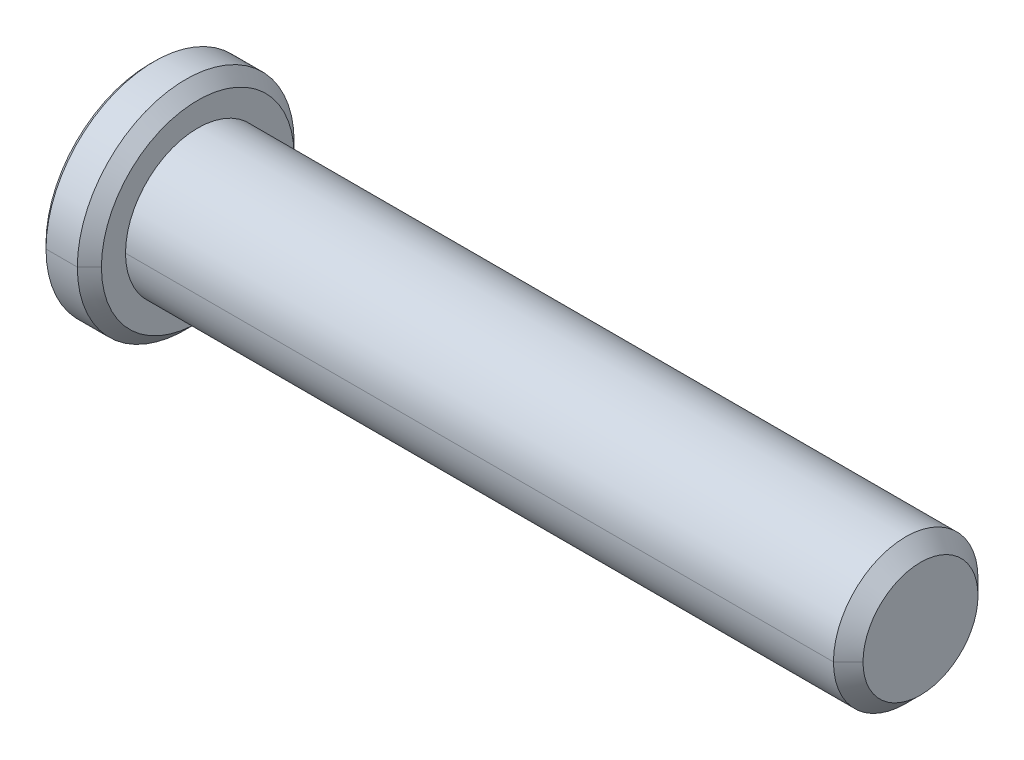
ISO-10303-21;
HEADER;
FILE_DESCRIPTION(('STEP AP214'),'2;1');
FILE_NAME('part.step','',(''),(''),'','','');
FILE_SCHEMA(('AUTOMOTIVE_DESIGN { 1 0 10303 214 1 1 1 1 }'));
ENDSEC;
DATA;
#1=APPLICATION_CONTEXT('core data for automotive mechanical design processes');
#2=APPLICATION_PROTOCOL_DEFINITION('international standard','automotive_design',2000,#1);
#3=PRODUCT_CONTEXT('',#1,'mechanical');
#4=PRODUCT('Part','Part','',(#3));
#5=PRODUCT_RELATED_PRODUCT_CATEGORY('part','',(#4));
#6=PRODUCT_DEFINITION_FORMATION('','',#4);
#7=PRODUCT_DEFINITION_CONTEXT('part definition',#1,'design');
#8=PRODUCT_DEFINITION('design','',#6,#7);
#9=PRODUCT_DEFINITION_SHAPE('','',#8);
#10=(LENGTH_UNIT() NAMED_UNIT(*) SI_UNIT(.MILLI.,.METRE.));
#11=(NAMED_UNIT(*) PLANE_ANGLE_UNIT() SI_UNIT($,.RADIAN.));
#12=(NAMED_UNIT(*) SI_UNIT($,.STERADIAN.) SOLID_ANGLE_UNIT());
#13=UNCERTAINTY_MEASURE_WITH_UNIT(LENGTH_MEASURE(1.E-05),#10,'distance_accuracy_value','');
#14=(GEOMETRIC_REPRESENTATION_CONTEXT(3) GLOBAL_UNCERTAINTY_ASSIGNED_CONTEXT((#13)) GLOBAL_UNIT_ASSIGNED_CONTEXT((#10,
#11,#12)) REPRESENTATION_CONTEXT('',''));
#15=CARTESIAN_POINT('',(0.,0.,0.));
#16=DIRECTION('',(0.,0.,1.));
#17=DIRECTION('',(1.,0.,0.));
#18=AXIS2_PLACEMENT_3D('',#15,#16,#17);
#19=CARTESIAN_POINT('',(-2.,0.,0.));
#20=DIRECTION('',(1.,0.,0.));
#21=DIRECTION('',(0.,-1.,0.));
#22=AXIS2_PLACEMENT_3D('',#19,#20,#21);
#23=CONICAL_SURFACE('',#22,4.3,0.7853981634);
#24=CARTESIAN_POINT('',(-1.8,0.,0.));
#25=DIRECTION('',(1.,0.,0.));
#26=DIRECTION('',(0.,0.,-1.));
#27=AXIS2_PLACEMENT_3D('',#24,#25,#26);
#28=CIRCLE('',#27,4.5);
#29=CARTESIAN_POINT('',(-1.8,0.,-4.5));
#30=VERTEX_POINT('',#29);
#31=CARTESIAN_POINT('',(-1.80000000000051,0.,4.50000000000051));
#32=VERTEX_POINT('',#31);
#33=EDGE_CURVE('E12',#30,#32,#28,.T.);
#34=ORIENTED_EDGE('',*,*,#33,.F.);
#35=CARTESIAN_POINT('',(-2.,0.,-4.3));
#36=DIRECTION('',(0.707106781184743,0.,-0.707106781188352));
#37=VECTOR('',#36,1.);
#38=LINE('',#35,#37);
#39=CARTESIAN_POINT('',(-2.,0.,-4.3));
#40=VERTEX_POINT('',#39);
#41=EDGE_CURVE('E30',#40,#30,#38,.T.);
#42=ORIENTED_EDGE('',*,*,#41,.F.);
#43=CARTESIAN_POINT('',(-2.,0.,0.));
#44=DIRECTION('',(1.,0.,0.));
#45=DIRECTION('',(0.,0.,-1.));
#46=AXIS2_PLACEMENT_3D('',#43,#44,#45);
#47=CIRCLE('',#46,4.3);
#48=CARTESIAN_POINT('',(-2.,0.,4.3));
#49=VERTEX_POINT('',#48);
#50=EDGE_CURVE('E201',#40,#49,#47,.T.);
#51=ORIENTED_EDGE('',*,*,#50,.T.);
#52=CARTESIAN_POINT('',(-2.,0.,4.3));
#53=DIRECTION('',(0.707106781184743,0.,0.707106781188352));
#54=VECTOR('',#53,1.);
#55=LINE('',#52,#54);
#56=EDGE_CURVE('E199',#49,#32,#55,.T.);
#57=ORIENTED_EDGE('',*,*,#56,.T.);
#58=EDGE_LOOP('',(#34,#42,#51,#57));
#59=FACE_BOUND('',#58,.T.);
#60=ADVANCED_FACE('F20',(#59),#23,.T.);
#61=CARTESIAN_POINT('',(-2.,0.,0.));
#62=DIRECTION('',(1.,0.,0.));
#63=DIRECTION('',(0.,1.,0.));
#64=AXIS2_PLACEMENT_3D('',#61,#62,#63);
#65=CONICAL_SURFACE('',#64,4.3,0.7853981634);
#66=CARTESIAN_POINT('',(-2.,0.,0.));
#67=DIRECTION('',(1.,0.,0.));
#68=DIRECTION('',(0.,0.,-1.));
#69=AXIS2_PLACEMENT_3D('',#66,#67,#68);
#70=CIRCLE('',#69,4.3);
#71=EDGE_CURVE('E185',#49,#40,#70,.T.);
#72=ORIENTED_EDGE('',*,*,#71,.T.);
#73=ORIENTED_EDGE('',*,*,#41,.T.);
#74=CARTESIAN_POINT('',(-1.8,0.,0.));
#75=DIRECTION('',(1.,0.,0.));
#76=DIRECTION('',(0.,0.,-1.));
#77=AXIS2_PLACEMENT_3D('',#74,#75,#76);
#78=CIRCLE('',#77,4.5);
#79=EDGE_CURVE('E356',#32,#30,#78,.T.);
#80=ORIENTED_EDGE('',*,*,#79,.F.);
#81=ORIENTED_EDGE('',*,*,#56,.F.);
#82=EDGE_LOOP('',(#72,#73,#80,#81));
#83=FACE_BOUND('',#82,.T.);
#84=ADVANCED_FACE('F330',(#83),#65,.T.);
#85=CARTESIAN_POINT('',(30.,0.,0.));
#86=DIRECTION('',(-1.,0.,0.));
#87=DIRECTION('',(0.,1.,0.));
#88=AXIS2_PLACEMENT_3D('',#85,#86,#87);
#89=CYLINDRICAL_SURFACE('',#88,4.5);
#90=ORIENTED_EDGE('',*,*,#79,.T.);
#91=CARTESIAN_POINT('',(-0.5,0.,-4.5));
#92=DIRECTION('',(-1.,0.,0.));
#93=VECTOR('',#92,1.);
#94=LINE('',#91,#93);
#95=CARTESIAN_POINT('',(-0.5,0.,-4.5));
#96=VERTEX_POINT('',#95);
#97=EDGE_CURVE('E359',#96,#30,#94,.T.);
#98=ORIENTED_EDGE('',*,*,#97,.F.);
#99=CARTESIAN_POINT('',(-0.5,0.,0.));
#100=DIRECTION('',(1.,0.,0.));
#101=DIRECTION('',(0.,0.,-1.));
#102=AXIS2_PLACEMENT_3D('',#99,#100,#101);
#103=CIRCLE('',#102,4.5);
#104=CARTESIAN_POINT('',(-0.5,0.,4.5));
#105=VERTEX_POINT('',#104);
#106=EDGE_CURVE('E365',#105,#96,#103,.T.);
#107=ORIENTED_EDGE('',*,*,#106,.F.);
#108=CARTESIAN_POINT('',(-0.5,0.,4.5));
#109=DIRECTION('',(-1.,0.,0.));
#110=VECTOR('',#109,1.);
#111=LINE('',#108,#110);
#112=EDGE_CURVE('E371',#105,#32,#111,.T.);
#113=ORIENTED_EDGE('',*,*,#112,.T.);
#114=EDGE_LOOP('',(#90,#98,#107,#113));
#115=FACE_BOUND('',#114,.T.);
#116=ADVANCED_FACE('F339',(#115),#89,.T.);
#117=CARTESIAN_POINT('',(30.,0.,0.));
#118=DIRECTION('',(-1.,0.,0.));
#119=DIRECTION('',(0.,-1.,0.));
#120=AXIS2_PLACEMENT_3D('',#117,#118,#119);
#121=CYLINDRICAL_SURFACE('',#120,4.5);
#122=CARTESIAN_POINT('',(-0.5,0.,0.));
#123=DIRECTION('',(1.,0.,0.));
#124=DIRECTION('',(0.,0.,-1.));
#125=AXIS2_PLACEMENT_3D('',#122,#123,#124);
#126=CIRCLE('',#125,4.5);
#127=EDGE_CURVE('E377',#96,#105,#126,.T.);
#128=ORIENTED_EDGE('',*,*,#127,.F.);
#129=ORIENTED_EDGE('',*,*,#97,.T.);
#130=ORIENTED_EDGE('',*,*,#33,.T.);
#131=ORIENTED_EDGE('',*,*,#112,.F.);
#132=EDGE_LOOP('',(#128,#129,#130,#131));
#133=FACE_BOUND('',#132,.T.);
#134=ADVANCED_FACE('F434',(#133),#121,.T.);
#135=CARTESIAN_POINT('',(-0.5,0.,0.));
#136=DIRECTION('',(-1.,0.,0.));
#137=DIRECTION('',(0.,-1.,0.));
#138=AXIS2_PLACEMENT_3D('',#135,#136,#137);
#139=CONICAL_SURFACE('',#138,4.5,0.7853981634);
#140=CARTESIAN_POINT('',(0.,0.,0.));
#141=DIRECTION('',(1.,0.,0.));
#142=DIRECTION('',(0.,0.,-1.));
#143=AXIS2_PLACEMENT_3D('',#140,#141,#142);
#144=CIRCLE('',#143,4.);
#145=CARTESIAN_POINT('',(0.,0.,-4.));
#146=VERTEX_POINT('',#145);
#147=CARTESIAN_POINT('',(-1.275812788748E-12,0.,3.99999999999872));
#148=VERTEX_POINT('',#147);
#149=EDGE_CURVE('E468',#146,#148,#144,.T.);
#150=ORIENTED_EDGE('',*,*,#149,.F.);
#151=CARTESIAN_POINT('',(-1.27578069636369E-12,0.,-3.99999999999872));
#152=DIRECTION('',(-0.707106781184743,0.,-0.707106781188352));
#153=VECTOR('',#152,1.);
#154=LINE('',#151,#153);
#155=EDGE_CURVE('E450',#146,#96,#154,.T.);
#156=ORIENTED_EDGE('',*,*,#155,.T.);
#157=ORIENTED_EDGE('',*,*,#127,.T.);
#158=CARTESIAN_POINT('',(-1.27578069636369E-12,0.,3.99999999999872));
#159=DIRECTION('',(-0.707106781184743,0.,0.707106781188352));
#160=VECTOR('',#159,1.);
#161=LINE('',#158,#160);
#162=EDGE_CURVE('E463',#148,#105,#161,.T.);
#163=ORIENTED_EDGE('',*,*,#162,.F.);
#164=EDGE_LOOP('',(#150,#156,#157,#163));
#165=FACE_BOUND('',#164,.T.);
#166=ADVANCED_FACE('F425',(#165),#139,.T.);
#167=CARTESIAN_POINT('',(-0.5,0.,0.));
#168=DIRECTION('',(-1.,0.,0.));
#169=DIRECTION('',(0.,1.,0.));
#170=AXIS2_PLACEMENT_3D('',#167,#168,#169);
#171=CONICAL_SURFACE('',#170,4.5,0.7853981634);
#172=ORIENTED_EDGE('',*,*,#106,.T.);
#173=ORIENTED_EDGE('',*,*,#155,.F.);
#174=CARTESIAN_POINT('',(0.,0.,0.));
#175=DIRECTION('',(1.,0.,0.));
#176=DIRECTION('',(0.,0.,-1.));
#177=AXIS2_PLACEMENT_3D('',#174,#175,#176);
#178=CIRCLE('',#177,4.);
#179=EDGE_CURVE('E402',#148,#146,#178,.T.);
#180=ORIENTED_EDGE('',*,*,#179,.F.);
#181=ORIENTED_EDGE('',*,*,#162,.T.);
#182=EDGE_LOOP('',(#172,#173,#180,#181));
#183=FACE_BOUND('',#182,.T.);
#184=ADVANCED_FACE('F433',(#183),#171,.T.);
#185=CARTESIAN_POINT('',(0.,4.,0.));
#186=DIRECTION('',(-1.,0.,0.));
#187=DIRECTION('',(0.,0.,1.));
#188=AXIS2_PLACEMENT_3D('',#185,#186,#187);
#189=PLANE('',#188);
#190=CARTESIAN_POINT('',(0.,0.,0.));
#191=DIRECTION('',(1.,0.,0.));
#192=DIRECTION('',(0.,0.,-1.));
#193=AXIS2_PLACEMENT_3D('',#190,#191,#192);
#194=CIRCLE('',#193,3.);
#195=CARTESIAN_POINT('',(0.,0.,-3.));
#196=VERTEX_POINT('',#195);
#197=CARTESIAN_POINT('',(0.,0.,3.));
#198=VERTEX_POINT('',#197);
#199=EDGE_CURVE('E397',#196,#198,#194,.T.);
#200=ORIENTED_EDGE('',*,*,#199,.F.);
#201=CARTESIAN_POINT('',(0.,0.,0.));
#202=DIRECTION('',(1.,0.,0.));
#203=DIRECTION('',(0.,0.,-1.));
#204=AXIS2_PLACEMENT_3D('',#201,#202,#203);
#205=CIRCLE('',#204,3.);
#206=EDGE_CURVE('E395',#198,#196,#205,.T.);
#207=ORIENTED_EDGE('',*,*,#206,.F.);
#208=EDGE_LOOP('',(#200,#207));
#209=FACE_BOUND('',#208,.T.);
#210=ORIENTED_EDGE('',*,*,#149,.T.);
#211=ORIENTED_EDGE('',*,*,#179,.T.);
#212=EDGE_LOOP('',(#210,#211));
#213=FACE_BOUND('',#212,.T.);
#214=ADVANCED_FACE('F599',(#209,#213),#189,.F.);
#215=CARTESIAN_POINT('',(30.,0.,0.));
#216=DIRECTION('',(-1.,0.,0.));
#217=DIRECTION('',(0.,1.,0.));
#218=AXIS2_PLACEMENT_3D('',#215,#216,#217);
#219=CYLINDRICAL_SURFACE('',#218,3.);
#220=ORIENTED_EDGE('',*,*,#206,.T.);
#221=CARTESIAN_POINT('',(29.3865,0.,-3.));
#222=DIRECTION('',(-1.,0.,0.));
#223=VECTOR('',#222,1.);
#224=LINE('',#221,#223);
#225=CARTESIAN_POINT('',(29.3865,0.,-3.));
#226=VERTEX_POINT('',#225);
#227=EDGE_CURVE('E554',#226,#196,#224,.T.);
#228=ORIENTED_EDGE('',*,*,#227,.F.);
#229=CARTESIAN_POINT('',(29.3865,0.,0.));
#230=DIRECTION('',(1.,0.,0.));
#231=DIRECTION('',(0.,0.,-1.));
#232=AXIS2_PLACEMENT_3D('',#229,#230,#231);
#233=CIRCLE('',#232,3.);
#234=CARTESIAN_POINT('',(29.3865,0.,3.));
#235=VERTEX_POINT('',#234);
#236=EDGE_CURVE('E550',#235,#226,#233,.T.);
#237=ORIENTED_EDGE('',*,*,#236,.F.);
#238=CARTESIAN_POINT('',(29.3865,0.,3.));
#239=DIRECTION('',(-1.,0.,0.));
#240=VECTOR('',#239,1.);
#241=LINE('',#238,#240);
#242=EDGE_CURVE('E547',#235,#198,#241,.T.);
#243=ORIENTED_EDGE('',*,*,#242,.T.);
#244=EDGE_LOOP('',(#220,#228,#237,#243));
#245=FACE_BOUND('',#244,.T.);
#246=ADVANCED_FACE('F527',(#245),#219,.T.);
#247=CARTESIAN_POINT('',(30.,0.,0.));
#248=DIRECTION('',(-1.,0.,0.));
#249=DIRECTION('',(0.,-1.,0.));
#250=AXIS2_PLACEMENT_3D('',#247,#248,#249);
#251=CYLINDRICAL_SURFACE('',#250,3.);
#252=CARTESIAN_POINT('',(29.3865,0.,0.));
#253=DIRECTION('',(1.,0.,0.));
#254=DIRECTION('',(0.,0.,-1.));
#255=AXIS2_PLACEMENT_3D('',#252,#253,#254);
#256=CIRCLE('',#255,3.);
#257=EDGE_CURVE('E543',#226,#235,#256,.T.);
#258=ORIENTED_EDGE('',*,*,#257,.F.);
#259=ORIENTED_EDGE('',*,*,#227,.T.);
#260=ORIENTED_EDGE('',*,*,#199,.T.);
#261=ORIENTED_EDGE('',*,*,#242,.F.);
#262=EDGE_LOOP('',(#258,#259,#260,#261));
#263=FACE_BOUND('',#262,.T.);
#264=ADVANCED_FACE('F518',(#263),#251,.T.);
#265=CARTESIAN_POINT('',(29.3865,0.,0.));
#266=DIRECTION('',(-1.,0.,0.));
#267=DIRECTION('',(0.,-1.,0.));
#268=AXIS2_PLACEMENT_3D('',#265,#266,#267);
#269=CONICAL_SURFACE('',#268,3.,0.7853981634);
#270=CARTESIAN_POINT('',(30.,0.,0.));
#271=DIRECTION('',(1.,0.,0.));
#272=DIRECTION('',(0.,0.,-1.));
#273=AXIS2_PLACEMENT_3D('',#270,#271,#272);
#274=CIRCLE('',#273,2.3865);
#275=CARTESIAN_POINT('',(30.,0.,-2.3865));
#276=VERTEX_POINT('',#275);
#277=CARTESIAN_POINT('',(29.9999999999984,0.,2.38649999999844));
#278=VERTEX_POINT('',#277);
#279=EDGE_CURVE('E539',#276,#278,#274,.T.);
#280=ORIENTED_EDGE('',*,*,#279,.F.);
#281=CARTESIAN_POINT('',(29.9999999999984,0.,-2.38649999999843));
#282=DIRECTION('',(-0.707106781184743,0.,-0.707106781188351));
#283=VECTOR('',#282,1.);
#284=LINE('',#281,#283);
#285=EDGE_CURVE('E294',#276,#226,#284,.T.);
#286=ORIENTED_EDGE('',*,*,#285,.T.);
#287=ORIENTED_EDGE('',*,*,#257,.T.);
#288=CARTESIAN_POINT('',(29.9999999999984,0.,2.38649999999843));
#289=DIRECTION('',(-0.707106781184743,0.,0.707106781188351));
#290=VECTOR('',#289,1.);
#291=LINE('',#288,#290);
#292=EDGE_CURVE('E307',#278,#235,#291,.T.);
#293=ORIENTED_EDGE('',*,*,#292,.F.);
#294=EDGE_LOOP('',(#280,#286,#287,#293));
#295=FACE_BOUND('',#294,.T.);
#296=ADVANCED_FACE('F272',(#295),#269,.T.);
#297=CARTESIAN_POINT('',(29.3865,0.,0.));
#298=DIRECTION('',(-1.,0.,0.));
#299=DIRECTION('',(0.,1.,0.));
#300=AXIS2_PLACEMENT_3D('',#297,#298,#299);
#301=CONICAL_SURFACE('',#300,3.,0.7853981634);
#302=ORIENTED_EDGE('',*,*,#236,.T.);
#303=ORIENTED_EDGE('',*,*,#285,.F.);
#304=CARTESIAN_POINT('',(30.,0.,0.));
#305=DIRECTION('',(1.,0.,0.));
#306=DIRECTION('',(0.,0.,-1.));
#307=AXIS2_PLACEMENT_3D('',#304,#305,#306);
#308=CIRCLE('',#307,2.3865);
#309=EDGE_CURVE('E250',#278,#276,#308,.T.);
#310=ORIENTED_EDGE('',*,*,#309,.F.);
#311=ORIENTED_EDGE('',*,*,#292,.T.);
#312=EDGE_LOOP('',(#302,#303,#310,#311));
#313=FACE_BOUND('',#312,.T.);
#314=ADVANCED_FACE('F261',(#313),#301,.T.);
#315=CARTESIAN_POINT('',(30.,2.3865,0.));
#316=DIRECTION('',(-1.,0.,0.));
#317=DIRECTION('',(0.,0.,1.));
#318=AXIS2_PLACEMENT_3D('',#315,#316,#317);
#319=PLANE('',#318);
#320=ORIENTED_EDGE('',*,*,#279,.T.);
#321=ORIENTED_EDGE('',*,*,#309,.T.);
#322=EDGE_LOOP('',(#320,#321));
#323=FACE_BOUND('',#322,.T.);
#324=ADVANCED_FACE('F271',(#323),#319,.F.);
#325=CARTESIAN_POINT('',(-2.,0.,0.));
#326=DIRECTION('',(1.,0.,0.));
#327=DIRECTION('',(0.,0.,-1.));
#328=AXIS2_PLACEMENT_3D('',#325,#326,#327);
#329=PLANE('',#328);
#330=ORIENTED_EDGE('',*,*,#50,.F.);
#331=ORIENTED_EDGE('',*,*,#71,.F.);
#332=EDGE_LOOP('',(#330,#331));
#333=FACE_BOUND('',#332,.T.);
#334=DIRECTION('',(0.,0.500000000000009,0.866025403784433));
#335=VECTOR('',#334,1.);
#336=CARTESIAN_POINT('',(-2.,-1.7320508075689,0.));
#337=LINE('',#336,#335);
#338=CARTESIAN_POINT('',(-2.,-1.7320508075689,0.));
#339=VERTEX_POINT('',#338);
#340=CARTESIAN_POINT('',(-2.,-0.86602540378444,1.5));
#341=VERTEX_POINT('',#340);
#342=EDGE_CURVE('E244',#339,#341,#337,.T.);
#343=ORIENTED_EDGE('',*,*,#342,.F.);
#344=DIRECTION('',(0.,-0.500000000000009,0.866025403784433));
#345=VECTOR('',#344,1.);
#346=CARTESIAN_POINT('',(-2.,-0.86602540378444,-1.5));
#347=LINE('',#346,#345);
#348=CARTESIAN_POINT('',(-2.,-0.86602540378444,-1.5));
#349=VERTEX_POINT('',#348);
#350=EDGE_CURVE('E240',#349,#339,#347,.T.);
#351=ORIENTED_EDGE('',*,*,#350,.F.);
#352=DIRECTION('',(0.,-1.,0.));
#353=VECTOR('',#352,1.);
#354=CARTESIAN_POINT('',(-2.,0.86602540378444,-1.5));
#355=LINE('',#354,#353);
#356=CARTESIAN_POINT('',(-2.,0.86602540378444,-1.5));
#357=VERTEX_POINT('',#356);
#358=EDGE_CURVE('E231',#357,#349,#355,.T.);
#359=ORIENTED_EDGE('',*,*,#358,.F.);
#360=DIRECTION('',(0.,-0.500000000000009,-0.866025403784433));
#361=VECTOR('',#360,1.);
#362=CARTESIAN_POINT('',(-2.,1.7320508075689,0.));
#363=LINE('',#362,#361);
#364=CARTESIAN_POINT('',(-2.,1.7320508075689,0.));
#365=VERTEX_POINT('',#364);
#366=EDGE_CURVE('E225',#365,#357,#363,.T.);
#367=ORIENTED_EDGE('',*,*,#366,.F.);
#368=DIRECTION('',(0.,0.500000000000009,-0.866025403784433));
#369=VECTOR('',#368,1.);
#370=CARTESIAN_POINT('',(-2.,0.86602540378444,1.5));
#371=LINE('',#370,#369);
#372=CARTESIAN_POINT('',(-2.,0.86602540378444,1.5));
#373=VERTEX_POINT('',#372);
#374=EDGE_CURVE('E133',#373,#365,#371,.T.);
#375=ORIENTED_EDGE('',*,*,#374,.F.);
#376=DIRECTION('',(0.,1.,0.));
#377=VECTOR('',#376,1.);
#378=CARTESIAN_POINT('',(-2.,-0.86602540378444,1.5));
#379=LINE('',#378,#377);
#380=EDGE_CURVE('E221',#341,#373,#379,.T.);
#381=ORIENTED_EDGE('',*,*,#380,.F.);
#382=EDGE_LOOP('',(#343,#351,#359,#367,#375,#381));
#383=FACE_BOUND('',#382,.T.);
#384=ADVANCED_FACE('F629',(#333,#383),#329,.F.);
#385=CARTESIAN_POINT('',(-0.5,-0.86602540378444,1.5));
#386=DIRECTION('',(0.,0.,1.));
#387=DIRECTION('',(1.,0.,0.));
#388=AXIS2_PLACEMENT_3D('',#385,#386,#387);
#389=PLANE('',#388);
#390=ORIENTED_EDGE('',*,*,#380,.T.);
#391=DIRECTION('',(-1.,0.,0.));
#392=VECTOR('',#391,1.);
#393=CARTESIAN_POINT('',(-0.5,0.86602540378444,1.5));
#394=LINE('',#393,#392);
#395=CARTESIAN_POINT('',(-0.5,0.86602540378444,1.5));
#396=VERTEX_POINT('',#395);
#397=EDGE_CURVE('E808',#396,#373,#394,.T.);
#398=ORIENTED_EDGE('',*,*,#397,.F.);
#399=DIRECTION('',(0.,1.,0.));
#400=VECTOR('',#399,1.);
#401=CARTESIAN_POINT('',(-0.5,-0.86602540378444,1.5));
#402=LINE('',#401,#400);
#403=CARTESIAN_POINT('',(-0.5,-0.86602540378444,1.5));
#404=VERTEX_POINT('',#403);
#405=EDGE_CURVE('E139',#404,#396,#402,.T.);
#406=ORIENTED_EDGE('',*,*,#405,.F.);
#407=DIRECTION('',(-1.,0.,0.));
#408=VECTOR('',#407,1.);
#409=CARTESIAN_POINT('',(-0.5,-0.86602540378444,1.5));
#410=LINE('',#409,#408);
#411=EDGE_CURVE('E812',#404,#341,#410,.T.);
#412=ORIENTED_EDGE('',*,*,#411,.T.);
#413=EDGE_LOOP('',(#390,#398,#406,#412));
#414=FACE_BOUND('',#413,.T.);
#415=ADVANCED_FACE('F636',(#414),#389,.F.);
#416=CARTESIAN_POINT('',(-0.5,-1.7320508075689,0.));
#417=DIRECTION('',(0.,-0.866025403784433,0.500000000000009));
#418=DIRECTION('',(0.,-0.500000000000009,-0.866025403784433));
#419=AXIS2_PLACEMENT_3D('',#416,#417,#418);
#420=PLANE('',#419);
#421=ORIENTED_EDGE('',*,*,#342,.T.);
#422=ORIENTED_EDGE('',*,*,#411,.F.);
#423=DIRECTION('',(0.,0.500000000000009,0.866025403784433));
#424=VECTOR('',#423,1.);
#425=CARTESIAN_POINT('',(-0.5,-1.7320508075689,0.));
#426=LINE('',#425,#424);
#427=CARTESIAN_POINT('',(-0.5,-1.7320508075689,0.));
#428=VERTEX_POINT('',#427);
#429=EDGE_CURVE('E816',#428,#404,#426,.T.);
#430=ORIENTED_EDGE('',*,*,#429,.F.);
#431=DIRECTION('',(-1.,0.,0.));
#432=VECTOR('',#431,1.);
#433=CARTESIAN_POINT('',(-0.5,-1.7320508075689,0.));
#434=LINE('',#433,#432);
#435=EDGE_CURVE('E168',#428,#339,#434,.T.);
#436=ORIENTED_EDGE('',*,*,#435,.T.);
#437=EDGE_LOOP('',(#421,#422,#430,#436));
#438=FACE_BOUND('',#437,.T.);
#439=ADVANCED_FACE('F644',(#438),#420,.F.);
#440=CARTESIAN_POINT('',(-0.5,-0.86602540378444,-1.5));
#441=DIRECTION('',(0.,-0.866025403784433,-0.500000000000009));
#442=DIRECTION('',(0.,0.500000000000009,-0.866025403784433));
#443=AXIS2_PLACEMENT_3D('',#440,#441,#442);
#444=PLANE('',#443);
#445=ORIENTED_EDGE('',*,*,#350,.T.);
#446=ORIENTED_EDGE('',*,*,#435,.F.);
#447=DIRECTION('',(0.,-0.500000000000009,0.866025403784433));
#448=VECTOR('',#447,1.);
#449=CARTESIAN_POINT('',(-0.5,-0.86602540378444,-1.5));
#450=LINE('',#449,#448);
#451=CARTESIAN_POINT('',(-0.5,-0.86602540378444,-1.5));
#452=VERTEX_POINT('',#451);
#453=EDGE_CURVE('E163',#452,#428,#450,.T.);
#454=ORIENTED_EDGE('',*,*,#453,.F.);
#455=DIRECTION('',(-1.,0.,0.));
#456=VECTOR('',#455,1.);
#457=CARTESIAN_POINT('',(-0.5,-0.86602540378444,-1.5));
#458=LINE('',#457,#456);
#459=EDGE_CURVE('E157',#452,#349,#458,.T.);
#460=ORIENTED_EDGE('',*,*,#459,.T.);
#461=EDGE_LOOP('',(#445,#446,#454,#460));
#462=FACE_BOUND('',#461,.T.);
#463=ADVANCED_FACE('F653',(#462),#444,.F.);
#464=CARTESIAN_POINT('',(-0.5,0.86602540378444,-1.5));
#465=DIRECTION('',(0.,0.,-1.));
#466=DIRECTION('',(-1.,0.,0.));
#467=AXIS2_PLACEMENT_3D('',#464,#465,#466);
#468=PLANE('',#467);
#469=ORIENTED_EDGE('',*,*,#358,.T.);
#470=ORIENTED_EDGE('',*,*,#459,.F.);
#471=DIRECTION('',(0.,-1.,0.));
#472=VECTOR('',#471,1.);
#473=CARTESIAN_POINT('',(-0.5,0.86602540378444,-1.5));
#474=LINE('',#473,#472);
#475=CARTESIAN_POINT('',(-0.5,0.86602540378444,-1.5));
#476=VERTEX_POINT('',#475);
#477=EDGE_CURVE('E152',#476,#452,#474,.T.);
#478=ORIENTED_EDGE('',*,*,#477,.F.);
#479=DIRECTION('',(-1.,0.,0.));
#480=VECTOR('',#479,1.);
#481=CARTESIAN_POINT('',(-0.5,0.86602540378444,-1.5));
#482=LINE('',#481,#480);
#483=EDGE_CURVE('E121',#476,#357,#482,.T.);
#484=ORIENTED_EDGE('',*,*,#483,.T.);
#485=EDGE_LOOP('',(#469,#470,#478,#484));
#486=FACE_BOUND('',#485,.T.);
#487=ADVANCED_FACE('F662',(#486),#468,.F.);
#488=CARTESIAN_POINT('',(-0.5,1.7320508075689,0.));
#489=DIRECTION('',(0.,0.866025403784433,-0.500000000000009));
#490=DIRECTION('',(0.,0.500000000000009,0.866025403784433));
#491=AXIS2_PLACEMENT_3D('',#488,#489,#490);
#492=PLANE('',#491);
#493=ORIENTED_EDGE('',*,*,#366,.T.);
#494=ORIENTED_EDGE('',*,*,#483,.F.);
#495=DIRECTION('',(0.,-0.500000000000009,-0.866025403784433));
#496=VECTOR('',#495,1.);
#497=CARTESIAN_POINT('',(-0.5,1.7320508075689,0.));
#498=LINE('',#497,#496);
#499=CARTESIAN_POINT('',(-0.5,1.7320508075689,0.));
#500=VERTEX_POINT('',#499);
#501=EDGE_CURVE('E114',#500,#476,#498,.T.);
#502=ORIENTED_EDGE('',*,*,#501,.F.);
#503=DIRECTION('',(-1.,0.,0.));
#504=VECTOR('',#503,1.);
#505=CARTESIAN_POINT('',(-0.5,1.7320508075689,0.));
#506=LINE('',#505,#504);
#507=EDGE_CURVE('E118',#500,#365,#506,.T.);
#508=ORIENTED_EDGE('',*,*,#507,.T.);
#509=EDGE_LOOP('',(#493,#494,#502,#508));
#510=FACE_BOUND('',#509,.T.);
#511=ADVANCED_FACE('F117',(#510),#492,.F.);
#512=CARTESIAN_POINT('',(-0.5,0.86602540378444,1.5));
#513=DIRECTION('',(0.,0.866025403784433,0.500000000000009));
#514=DIRECTION('',(0.,-0.500000000000009,0.866025403784433));
#515=AXIS2_PLACEMENT_3D('',#512,#513,#514);
#516=PLANE('',#515);
#517=ORIENTED_EDGE('',*,*,#374,.T.);
#518=ORIENTED_EDGE('',*,*,#507,.F.);
#519=DIRECTION('',(0.,0.500000000000009,-0.866025403784433));
#520=VECTOR('',#519,1.);
#521=CARTESIAN_POINT('',(-0.5,0.86602540378444,1.5));
#522=LINE('',#521,#520);
#523=EDGE_CURVE('E131',#396,#500,#522,.T.);
#524=ORIENTED_EDGE('',*,*,#523,.F.);
#525=ORIENTED_EDGE('',*,*,#397,.T.);
#526=EDGE_LOOP('',(#517,#518,#524,#525));
#527=FACE_BOUND('',#526,.T.);
#528=ADVANCED_FACE('F129',(#527),#516,.F.);
#529=CARTESIAN_POINT('',(-0.5,0.,0.));
#530=DIRECTION('',(-1.,0.,0.));
#531=DIRECTION('',(0.,0.,1.));
#532=AXIS2_PLACEMENT_3D('',#529,#530,#531);
#533=PLANE('',#532);
#534=ORIENTED_EDGE('',*,*,#453,.T.);
#535=ORIENTED_EDGE('',*,*,#429,.T.);
#536=ORIENTED_EDGE('',*,*,#405,.T.);
#537=ORIENTED_EDGE('',*,*,#523,.T.);
#538=ORIENTED_EDGE('',*,*,#501,.T.);
#539=ORIENTED_EDGE('',*,*,#477,.T.);
#540=EDGE_LOOP('',(#534,#535,#536,#537,#538,#539));
#541=FACE_BOUND('',#540,.T.);
#542=ADVANCED_FACE('F137',(#541),#533,.T.);
#543=CLOSED_SHELL('',(#60,#84,#116,#134,#166,#184,#214,#246,#264,#296,#314,#324,#384,#415,#439,
#463,#487,#511,#528,#542));
#544=MANIFOLD_SOLID_BREP('B1',#543);
#545=ADVANCED_BREP_SHAPE_REPRESENTATION('',(#18,#544),#14);
#546=SHAPE_DEFINITION_REPRESENTATION(#9,#545);
ENDSEC;
END-ISO-10303-21;
